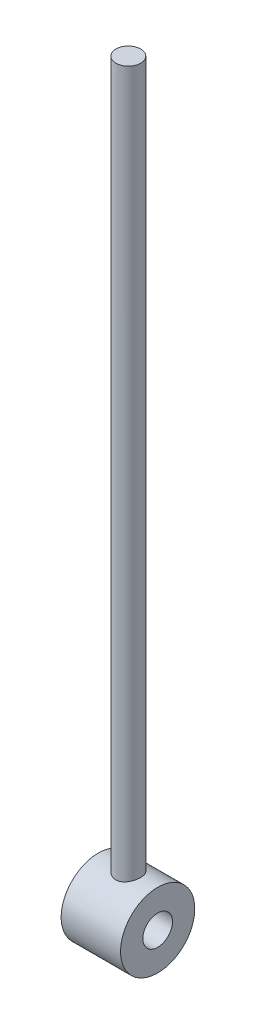
ISO-10303-21;
HEADER;
FILE_DESCRIPTION(('STEP AP214'),'2;1');
FILE_NAME('part.step','',(''),(''),'','','');
FILE_SCHEMA(('AUTOMOTIVE_DESIGN { 1 0 10303 214 1 1 1 1 }'));
ENDSEC;
DATA;
#1=APPLICATION_CONTEXT('core data for automotive mechanical design processes');
#2=APPLICATION_PROTOCOL_DEFINITION('international standard','automotive_design',2000,#1);
#3=PRODUCT_CONTEXT('',#1,'mechanical');
#4=PRODUCT('Part','Part','',(#3));
#5=PRODUCT_RELATED_PRODUCT_CATEGORY('part','',(#4));
#6=PRODUCT_DEFINITION_FORMATION('','',#4);
#7=PRODUCT_DEFINITION_CONTEXT('part definition',#1,'design');
#8=PRODUCT_DEFINITION('design','',#6,#7);
#9=PRODUCT_DEFINITION_SHAPE('','',#8);
#10=(LENGTH_UNIT() NAMED_UNIT(*) SI_UNIT(.MILLI.,.METRE.));
#11=(NAMED_UNIT(*) PLANE_ANGLE_UNIT() SI_UNIT($,.RADIAN.));
#12=(NAMED_UNIT(*) SI_UNIT($,.STERADIAN.) SOLID_ANGLE_UNIT());
#13=UNCERTAINTY_MEASURE_WITH_UNIT(LENGTH_MEASURE(1.E-05),#10,'distance_accuracy_value','');
#14=(GEOMETRIC_REPRESENTATION_CONTEXT(3) GLOBAL_UNCERTAINTY_ASSIGNED_CONTEXT((#13)) GLOBAL_UNIT_ASSIGNED_CONTEXT((#10,
#11,#12)) REPRESENTATION_CONTEXT('',''));
#15=CARTESIAN_POINT('',(0.,0.,0.));
#16=DIRECTION('',(0.,0.,1.));
#17=DIRECTION('',(1.,0.,0.));
#18=AXIS2_PLACEMENT_3D('',#15,#16,#17);
#19=CARTESIAN_POINT('',(12.,0.,0.));
#20=DIRECTION('',(-1.,0.,0.));
#21=DIRECTION('',(0.,0.,1.));
#22=AXIS2_PLACEMENT_3D('',#19,#20,#21);
#23=CYLINDRICAL_SURFACE('',#22,7.5);
#24=CARTESIAN_POINT('',(12.,0.,0.));
#25=DIRECTION('',(1.,0.,0.));
#26=DIRECTION('',(0.,0.,-1.));
#27=AXIS2_PLACEMENT_3D('',#24,#25,#26);
#28=CIRCLE('',#27,7.5);
#29=CARTESIAN_POINT('',(12.,0.,-7.5));
#30=VERTEX_POINT('',#29);
#31=EDGE_CURVE('E44',#30,#30,#28,.T.);
#32=ORIENTED_EDGE('',*,*,#31,.F.);
#33=EDGE_LOOP('',(#32));
#34=FACE_BOUND('',#33,.T.);
#35=CARTESIAN_POINT('',(0.,0.,0.));
#36=DIRECTION('',(1.,0.,0.));
#37=DIRECTION('',(0.,0.,-1.));
#38=AXIS2_PLACEMENT_3D('',#35,#36,#37);
#39=CIRCLE('',#38,7.5);
#40=CARTESIAN_POINT('',(0.,0.,-7.5));
#41=VERTEX_POINT('',#40);
#42=EDGE_CURVE('E48',#41,#41,#39,.T.);
#43=ORIENTED_EDGE('',*,*,#42,.T.);
#44=EDGE_LOOP('',(#43));
#45=FACE_BOUND('',#44,.T.);
#46=CARTESIAN_POINT('',(6.06560969529937,7.07106781186548,-2.5));
#47=CARTESIAN_POINT('',(5.92943925820919,7.07106736326085,-2.50000064486928));
#48=CARTESIAN_POINT('',(5.79327269574038,7.07504423227143,-2.48883695921381));
#49=CARTESIAN_POINT('',(5.52497364281374,7.09043935203137,-2.44462782922202));
#50=CARTESIAN_POINT('',(5.39284182061819,7.10185882855472,-2.41157878042099));
#51=CARTESIAN_POINT('',(5.13654246280615,7.13070509221979,-2.32488871421226));
#52=CARTESIAN_POINT('',(5.01235987169258,7.14812009928304,-2.27128805350811));
#53=CARTESIAN_POINT('',(4.77470957392946,7.18697805025812,-2.14515407110345));
#54=CARTESIAN_POINT('',(4.66124423891529,7.20842188259031,-2.07261657215046));
#55=CARTESIAN_POINT('',(4.44380978945358,7.25386223518683,-1.90762786610719));
#56=CARTESIAN_POINT('',(4.34032112362005,7.2779223711161,-1.8145608534448));
#57=CARTESIAN_POINT('',(4.15009269223777,7.32534662002507,-1.61246916803599));
#58=CARTESIAN_POINT('',(4.06335561634344,7.34871062072404,-1.50344193763094));
#59=CARTESIAN_POINT('',(3.90691245197538,7.39284667304497,-1.26901126991252));
#60=CARTESIAN_POINT('',(3.83770976875447,7.41353519254014,-1.14325477806131));
#61=CARTESIAN_POINT('',(3.72163073248059,7.44923966927457,-0.881078057468685));
#62=CARTESIAN_POINT('',(3.6747483623571,7.46425715507505,-0.74466071421803));
#63=CARTESIAN_POINT('',(3.60627005871838,7.48647688579767,-0.470072043583736));
#64=CARTESIAN_POINT('',(3.58385107965685,7.49393286943898,-0.332126887132421));
#65=CARTESIAN_POINT('',(3.56231896189772,7.5010902054562,-0.0542446870602242));
#66=CARTESIAN_POINT('',(3.56319981616834,7.50079355657239,0.0856918338597404));
#67=CARTESIAN_POINT('',(3.58772033171444,7.49265099046828,0.357758787984536));
#68=CARTESIAN_POINT('',(3.61046601648559,7.48510161887793,0.489980121479141));
#69=CARTESIAN_POINT('',(3.67659214775055,7.46367418349329,0.748608597055428));
#70=CARTESIAN_POINT('',(3.71997399274893,7.44979569077954,0.875015344448039));
#71=CARTESIAN_POINT('',(3.82666298856451,7.41689175733061,1.12038118710493));
#72=CARTESIAN_POINT('',(3.89022454166565,7.39780106310039,1.23922055242211));
#73=CARTESIAN_POINT('',(4.03525895892101,7.35645982597298,1.46481081381831));
#74=CARTESIAN_POINT('',(4.11673680361844,7.33420840503667,1.57155833596335));
#75=CARTESIAN_POINT('',(4.29979567894861,7.28765479624741,1.77525216637827));
#76=CARTESIAN_POINT('',(4.40214258990307,7.26330537922194,1.87150039266318));
#77=CARTESIAN_POINT('',(4.62173150961591,7.21618338122252,2.04569314899543));
#78=CARTESIAN_POINT('',(4.73897580961948,7.19341104364038,2.12363485820386));
#79=CARTESIAN_POINT('',(4.98724375930797,7.15176312802781,2.25996863758936));
#80=CARTESIAN_POINT('',(5.1184400235938,7.1329477321187,2.31806615905335));
#81=CARTESIAN_POINT('',(5.38953818083541,7.10204127060962,2.41110798317334));
#82=CARTESIAN_POINT('',(5.52943639831498,7.08994738717732,2.44606198936873));
#83=CARTESIAN_POINT('',(5.8072055838283,7.07449090788963,2.4904032052438));
#84=CARTESIAN_POINT('',(5.94488325717101,7.0707590079689,2.50087273876908));
#85=CARTESIAN_POINT('',(6.22005006808463,7.07141680147961,2.4990135972743));
#86=CARTESIAN_POINT('',(6.35753923535934,7.07580501979536,2.48668906306691));
#87=CARTESIAN_POINT('',(6.62350210957914,7.09184045225748,2.44056412888078));
#88=CARTESIAN_POINT('',(6.75212327067647,7.10323313602101,2.40751598495171));
#89=CARTESIAN_POINT('',(7.00196871089733,7.13171384177557,2.32178465640117));
#90=CARTESIAN_POINT('',(7.12319167427632,7.14880287337099,2.26909799090856));
#91=CARTESIAN_POINT('',(7.35906074741686,7.18742193989467,2.14368585184734));
#92=CARTESIAN_POINT('',(7.47337630190387,7.20907564164071,2.07037779589624));
#93=CARTESIAN_POINT('',(7.68847482625866,7.25414421827413,1.9064640763939));
#94=CARTESIAN_POINT('',(7.78925379195241,7.27755961109486,1.81585331374696));
#95=CARTESIAN_POINT('',(7.97942965552596,7.32487596594623,1.61472926475081));
#96=CARTESIAN_POINT('',(8.06804567034649,7.34874608944741,1.50346817636663));
#97=CARTESIAN_POINT('',(8.22540005116947,7.39317129032772,1.26706822850064));
#98=CARTESIAN_POINT('',(8.29413912320543,7.41372648544237,1.14192986216138));
#99=CARTESIAN_POINT('',(8.40915995745365,7.44911014526507,0.881949656080739));
#100=CARTESIAN_POINT('',(8.45558788816953,7.46397575011328,0.747177808302992));
#101=CARTESIAN_POINT('',(8.52492905044963,7.48646527094436,0.471146164615041));
#102=CARTESIAN_POINT('',(8.54785077000062,7.49409180085047,0.329888729884724));
#103=CARTESIAN_POINT('',(8.56876488931347,7.50104658090641,0.0520383396501026));
#104=CARTESIAN_POINT('',(8.56787833013031,7.50074800223598,-0.084461809800046));
#105=CARTESIAN_POINT('',(8.54396642493334,7.49280491298495,-0.355277862500434));
#106=CARTESIAN_POINT('',(8.52094287491744,7.48516099833939,-0.489593942047642));
#107=CARTESIAN_POINT('',(8.45415410885946,7.46352287386031,-0.750105298580147));
#108=CARTESIAN_POINT('',(8.41072415691703,7.44963145902871,-0.876395677281972));
#109=CARTESIAN_POINT('',(8.30466586755648,7.41692901761237,-1.11994587734949));
#110=CARTESIAN_POINT('',(8.24203405730684,7.39811710120041,-1.23720406035608));
#111=CARTESIAN_POINT('',(8.09668591504435,7.35664672069702,-1.46408504077196));
#112=CARTESIAN_POINT('',(8.01331298184527,7.33387181229816,-1.57326562889402));
#113=CARTESIAN_POINT('',(7.82996621740888,7.28732471979699,-1.77645256568107));
#114=CARTESIAN_POINT('',(7.72998708964255,7.26355221932743,-1.87045405406148));
#115=CARTESIAN_POINT('',(7.51158630633199,7.21658199563995,-2.04435452208279));
#116=CARTESIAN_POINT('',(7.39259591785777,7.19344319971577,-2.12355741499475));
#117=CARTESIAN_POINT('',(7.14227362804242,7.15150483307538,-2.26078585825279));
#118=CARTESIAN_POINT('',(7.0109449627252,7.13270412903123,-2.31881694204869));
#119=CARTESIAN_POINT('',(6.74570513526029,7.10253335516286,-2.40960957051041));
#120=CARTESIAN_POINT('',(6.61217903648595,7.09086582142956,-2.4433947728738));
#121=CARTESIAN_POINT('',(6.34096956913261,7.07513458848796,-2.48858580037317));
#122=CARTESIAN_POINT('',(6.20328765177259,7.07106826543653,-2.49999934799148));
#123=CARTESIAN_POINT('',(6.06560969529937,7.07106781186548,-2.5));
#124=B_SPLINE_CURVE_WITH_KNOTS('',3,(#46,#47,#48,#49,#50,#51,#52,#53,#54,#55,#56,#57,#58,#59,
#60,#61,#62,#63,#64,#65,#66,#67,#68,#69,#70,#71,#72,#73,#74,#75,#76,#77,#78,#79,#80,#81,#82,#83,
#84,#85,#86,#87,#88,#89,#90,#91,#92,#93,#94,#95,#96,#97,#98,#99,#100,#101,#102,#103,#104,#105,
#106,#107,#108,#109,#110,#111,#112,#113,#114,#115,#116,#117,#118,#119,#120,#121,#122,#123),
.UNSPECIFIED.,.T.,.F.,(4,2,2,2,2,2,2,2,2,2,2,2,2,2,2,2,2,2,2,2,2,2,2,2,2,2,2,2,2,2,2,2,2,2,2,2,
2,2,4),(0.,0.40800146199839,0.816070137537909,1.22334156875207,1.63070291546361,2.0525334356892,
2.4744316292997,2.90733765359143,3.34012690966973,3.75785796912336,4.17548133255818,
4.57672512063922,4.97799610473091,5.38454137150837,5.79119979685055,6.21700435909794,
6.64287449030265,7.07481599607639,7.50657628391539,7.91885728411099,8.33106339593084,
8.7291098942194,9.12722697867364,9.53797144339287,9.94883714155318,10.3794702042773,
10.8100879689383,11.2378447797713,11.6654470751039,12.0729521169409,12.4804241002445,
12.8814239010107,13.2824962690811,13.6983879880158,14.1144126108158,14.5467225684036,
14.9789194566717,15.3915803040673,15.8040986797616),.UNSPECIFIED.);
#125=CARTESIAN_POINT('',(6.06560969529937,7.07106781186548,-2.5));
#126=VERTEX_POINT('',#125);
#127=EDGE_CURVE('E10',#126,#126,#124,.T.);
#128=ORIENTED_EDGE('',*,*,#127,.F.);
#129=EDGE_LOOP('',(#128));
#130=FACE_BOUND('',#129,.T.);
#131=ADVANCED_FACE('F33',(#34,#45,#130),#23,.T.);
#132=CARTESIAN_POINT('',(12.,0.,0.));
#133=DIRECTION('',(1.,0.,0.));
#134=DIRECTION('',(0.,0.,-1.));
#135=AXIS2_PLACEMENT_3D('',#132,#133,#134);
#136=PLANE('',#135);
#137=CARTESIAN_POINT('',(12.,0.,0.));
#138=DIRECTION('',(1.,0.,0.));
#139=DIRECTION('',(0.,0.,-1.));
#140=AXIS2_PLACEMENT_3D('',#137,#138,#139);
#141=CIRCLE('',#140,3.);
#142=CARTESIAN_POINT('',(12.,0.,-3.));
#143=VERTEX_POINT('',#142);
#144=EDGE_CURVE('E60',#143,#143,#141,.T.);
#145=ORIENTED_EDGE('',*,*,#144,.F.);
#146=EDGE_LOOP('',(#145));
#147=FACE_BOUND('',#146,.T.);
#148=ORIENTED_EDGE('',*,*,#31,.T.);
#149=EDGE_LOOP('',(#148));
#150=FACE_BOUND('',#149,.T.);
#151=ADVANCED_FACE('F67',(#147,#150),#136,.T.);
#152=CARTESIAN_POINT('',(0.,0.,0.));
#153=DIRECTION('',(1.,0.,0.));
#154=DIRECTION('',(0.,0.,-1.));
#155=AXIS2_PLACEMENT_3D('',#152,#153,#154);
#156=PLANE('',#155);
#157=CARTESIAN_POINT('',(0.,0.,0.));
#158=DIRECTION('',(1.,0.,0.));
#159=DIRECTION('',(0.,0.,-1.));
#160=AXIS2_PLACEMENT_3D('',#157,#158,#159);
#161=CIRCLE('',#160,3.);
#162=CARTESIAN_POINT('',(0.,0.,-3.));
#163=VERTEX_POINT('',#162);
#164=EDGE_CURVE('E57',#163,#163,#161,.F.);
#165=ORIENTED_EDGE('',*,*,#164,.F.);
#166=EDGE_LOOP('',(#165));
#167=FACE_BOUND('',#166,.T.);
#168=ORIENTED_EDGE('',*,*,#42,.F.);
#169=EDGE_LOOP('',(#168));
#170=FACE_BOUND('',#169,.T.);
#171=ADVANCED_FACE('F69',(#167,#170),#156,.F.);
#172=CARTESIAN_POINT('',(6.06560969529937,150.,0.));
#173=DIRECTION('',(0.,-1.,0.));
#174=DIRECTION('',(0.,0.,-1.));
#175=AXIS2_PLACEMENT_3D('',#172,#173,#174);
#176=CYLINDRICAL_SURFACE('',#175,2.5);
#177=CARTESIAN_POINT('',(6.06560969529937,150.,0.));
#178=DIRECTION('',(0.,1.,0.));
#179=DIRECTION('',(0.,0.,1.));
#180=AXIS2_PLACEMENT_3D('',#177,#178,#179);
#181=CIRCLE('',#180,2.5);
#182=CARTESIAN_POINT('',(6.06560969529937,150.,2.5));
#183=VERTEX_POINT('',#182);
#184=EDGE_CURVE('E53',#183,#183,#181,.T.);
#185=ORIENTED_EDGE('',*,*,#184,.F.);
#186=EDGE_LOOP('',(#185));
#187=FACE_BOUND('',#186,.T.);
#188=ORIENTED_EDGE('',*,*,#127,.T.);
#189=EDGE_LOOP('',(#188));
#190=FACE_BOUND('',#189,.T.);
#191=ADVANCED_FACE('F75',(#187,#190),#176,.T.);
#192=CARTESIAN_POINT('',(6.06560969529937,150.,0.));
#193=DIRECTION('',(0.,1.,0.));
#194=DIRECTION('',(0.,0.,1.));
#195=AXIS2_PLACEMENT_3D('',#192,#193,#194);
#196=PLANE('',#195);
#197=ORIENTED_EDGE('',*,*,#184,.T.);
#198=EDGE_LOOP('',(#197));
#199=FACE_BOUND('',#198,.T.);
#200=ADVANCED_FACE('F81',(#199),#196,.T.);
#201=CARTESIAN_POINT('',(-0.000999999999999265,0.,0.));
#202=DIRECTION('',(1.,0.,0.));
#203=DIRECTION('',(0.,0.,-1.));
#204=AXIS2_PLACEMENT_3D('',#201,#202,#203);
#205=CYLINDRICAL_SURFACE('',#204,3.);
#206=ORIENTED_EDGE('',*,*,#144,.T.);
#207=EDGE_LOOP('',(#206));
#208=FACE_BOUND('',#207,.T.);
#209=ORIENTED_EDGE('',*,*,#164,.T.);
#210=EDGE_LOOP('',(#209));
#211=FACE_BOUND('',#210,.T.);
#212=ADVANCED_FACE('F64',(#208,#211),#205,.F.);
#213=CLOSED_SHELL('',(#131,#151,#171,#191,#200,#212));
#214=MANIFOLD_SOLID_BREP('B2',#213);
#215=ADVANCED_BREP_SHAPE_REPRESENTATION('',(#18,#214),#14);
#216=SHAPE_DEFINITION_REPRESENTATION(#9,#215);
ENDSEC;
END-ISO-10303-21;
